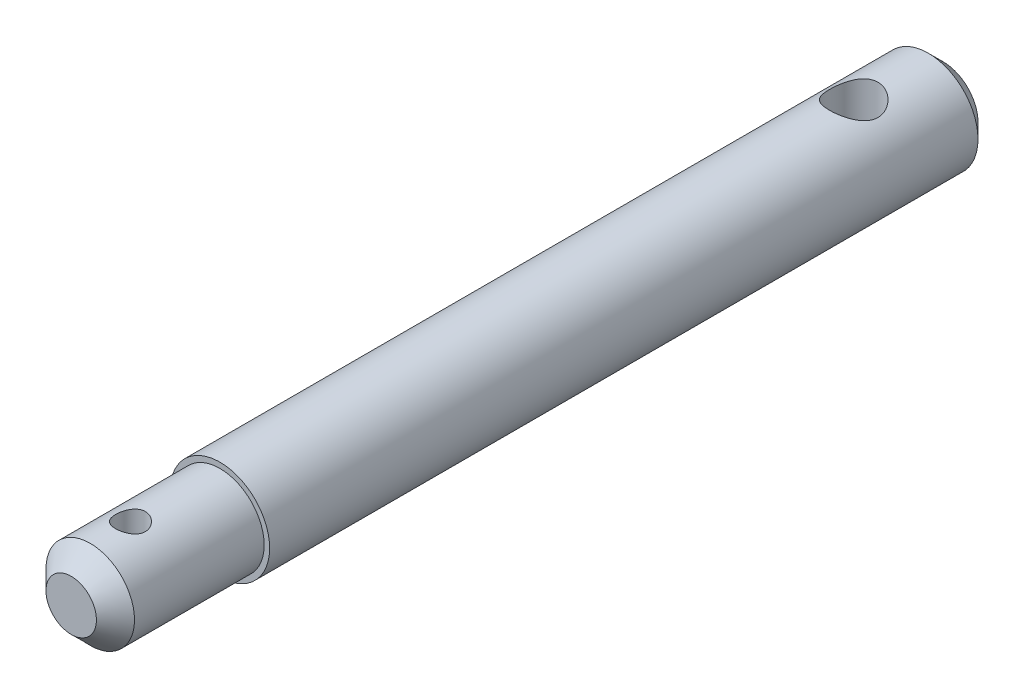
ISO-10303-21;
HEADER;
FILE_DESCRIPTION(('STEP AP214'),'2;1');
FILE_NAME('part.step','',(''),(''),'','','');
FILE_SCHEMA(('AUTOMOTIVE_DESIGN { 1 0 10303 214 1 1 1 1 }'));
ENDSEC;
DATA;
#1=APPLICATION_CONTEXT('core data for automotive mechanical design processes');
#2=APPLICATION_PROTOCOL_DEFINITION('international standard','automotive_design',2000,#1);
#3=PRODUCT_CONTEXT('',#1,'mechanical');
#4=PRODUCT('Part','Part','',(#3));
#5=PRODUCT_RELATED_PRODUCT_CATEGORY('part','',(#4));
#6=PRODUCT_DEFINITION_FORMATION('','',#4);
#7=PRODUCT_DEFINITION_CONTEXT('part definition',#1,'design');
#8=PRODUCT_DEFINITION('design','',#6,#7);
#9=PRODUCT_DEFINITION_SHAPE('','',#8);
#10=(LENGTH_UNIT() NAMED_UNIT(*) SI_UNIT(.MILLI.,.METRE.));
#11=(NAMED_UNIT(*) PLANE_ANGLE_UNIT() SI_UNIT($,.RADIAN.));
#12=(NAMED_UNIT(*) SI_UNIT($,.STERADIAN.) SOLID_ANGLE_UNIT());
#13=UNCERTAINTY_MEASURE_WITH_UNIT(LENGTH_MEASURE(1.E-05),#10,'distance_accuracy_value','');
#14=(GEOMETRIC_REPRESENTATION_CONTEXT(3) GLOBAL_UNCERTAINTY_ASSIGNED_CONTEXT((#13)) GLOBAL_UNIT_ASSIGNED_CONTEXT((#10,
#11,#12)) REPRESENTATION_CONTEXT('',''));
#15=CARTESIAN_POINT('',(0.,0.,0.));
#16=DIRECTION('',(0.,0.,1.));
#17=DIRECTION('',(1.,0.,0.));
#18=AXIS2_PLACEMENT_3D('',#15,#16,#17);
#19=CARTESIAN_POINT('',(0.,0.,46.5455));
#20=DIRECTION('',(0.,0.,1.));
#21=DIRECTION('',(1.,0.,0.));
#22=AXIS2_PLACEMENT_3D('',#19,#20,#21);
#23=PLANE('',#22);
#24=CARTESIAN_POINT('',(0.,0.,46.5454999999793));
#25=DIRECTION('',(0.,0.,-1.));
#26=DIRECTION('',(-1.,0.,0.));
#27=AXIS2_PLACEMENT_3D('',#24,#25,#26);
#28=CIRCLE('',#27,1.34620000000041);
#29=CARTESIAN_POINT('',(-1.34620000000041,0.,46.5454999999793));
#30=VERTEX_POINT('',#29);
#31=EDGE_CURVE('E17',#30,#30,#28,.T.);
#32=ORIENTED_EDGE('',*,*,#31,.F.);
#33=EDGE_LOOP('',(#32));
#34=FACE_BOUND('',#33,.T.);
#35=ADVANCED_FACE('F14',(#34),#23,.T.);
#36=CARTESIAN_POINT('',(0.,0.,45.5294999999865));
#37=DIRECTION('',(0.,0.,-1.));
#38=DIRECTION('',(-1.,0.,0.));
#39=AXIS2_PLACEMENT_3D('',#36,#37,#38);
#40=CONICAL_SURFACE('',#39,2.36219999999321,0.785398163397448);
#41=ORIENTED_EDGE('',*,*,#31,.T.);
#42=EDGE_LOOP('',(#41));
#43=FACE_BOUND('',#42,.T.);
#44=CARTESIAN_POINT('',(0.,0.,45.5295));
#45=DIRECTION('',(0.,0.,1.));
#46=DIRECTION('',(1.,0.,0.));
#47=AXIS2_PLACEMENT_3D('',#44,#45,#46);
#48=CIRCLE('',#47,2.3622);
#49=CARTESIAN_POINT('',(2.3622,0.,45.5295));
#50=VERTEX_POINT('',#49);
#51=EDGE_CURVE('E74',#50,#50,#48,.F.);
#52=ORIENTED_EDGE('',*,*,#51,.F.);
#53=EDGE_LOOP('',(#52));
#54=FACE_BOUND('',#53,.T.);
#55=ADVANCED_FACE('F94',(#43,#54),#40,.T.);
#56=CARTESIAN_POINT('',(0.,-12.7,43.3832));
#57=DIRECTION('',(0.,-1.,0.));
#58=DIRECTION('',(0.,0.,-1.));
#59=AXIS2_PLACEMENT_3D('',#56,#57,#58);
#60=CYLINDRICAL_SURFACE('',#59,0.79375);
#61=CARTESIAN_POINT('',(0.0789147910260834,-2.36088146584222,44.1730173955145));
#62=CARTESIAN_POINT('',(0.122507011681601,-2.35942430790102,44.1686618092289));
#63=CARTESIAN_POINT('',(0.165698028478989,-2.35676082438356,44.1606894490778));
#64=CARTESIAN_POINT('',(0.250012932307831,-2.34931394752991,44.1378138920095));
#65=CARTESIAN_POINT('',(0.29113625225935,-2.3445299761285,44.1229088051102));
#66=CARTESIAN_POINT('',(0.370122912277435,-2.33336395988406,44.0867141756947));
#67=CARTESIAN_POINT('',(0.407992552247541,-2.3269851013039,44.0654373460735));
#68=CARTESIAN_POINT('',(0.47965344487601,-2.31327781630098,44.0171088593755));
#69=CARTESIAN_POINT('',(0.513443978603177,-2.30594922296068,43.9900561866419));
#70=CARTESIAN_POINT('',(0.57723530537025,-2.29082957740467,43.9298502401553));
#71=CARTESIAN_POINT('',(0.607068555289485,-2.28303127128678,43.8965210779747));
#72=CARTESIAN_POINT('',(0.660784399884123,-2.26806796345517,43.825234946791));
#73=CARTESIAN_POINT('',(0.684666430168286,-2.26090302184889,43.7872775393705));
#74=CARTESIAN_POINT('',(0.725990017629597,-2.24797753083853,43.7072741076736));
#75=CARTESIAN_POINT('',(0.743364304289983,-2.24223184870206,43.6651907633595));
#76=CARTESIAN_POINT('',(0.770701655266178,-2.23298430668429,43.5784518604218));
#77=CARTESIAN_POINT('',(0.780667965000087,-2.22948146431323,43.5337974374313));
#78=CARTESIAN_POINT('',(0.792492738455014,-2.22530482146832,43.4455027189291));
#79=CARTESIAN_POINT('',(0.794719931423072,-2.22450242083551,43.4019177861813));
#80=CARTESIAN_POINT('',(0.792008852080534,-2.2254691684149,43.315004766584));
#81=CARTESIAN_POINT('',(0.787071637416175,-2.22723793705812,43.271676642771));
#82=CARTESIAN_POINT('',(0.77049230343537,-2.2330255240226,43.1878805437207));
#83=CARTESIAN_POINT('',(0.759060487724198,-2.23697366280072,43.1473656037016));
#84=CARTESIAN_POINT('',(0.730042352332865,-2.24661062802437,43.0688262701572));
#85=CARTESIAN_POINT('',(0.712454834007139,-2.25229979345751,43.030802363402));
#86=CARTESIAN_POINT('',(0.670890136452902,-2.26503487792193,42.9568067496328));
#87=CARTESIAN_POINT('',(0.646704152612892,-2.27212255697896,42.9209596739679));
#88=CARTESIAN_POINT('',(0.592898932463587,-2.2867522549457,42.8537042512372));
#89=CARTESIAN_POINT('',(0.563278092001751,-2.29429440755528,42.8222972195535));
#90=CARTESIAN_POINT('',(0.497797821533678,-2.30940795248484,42.7633072333394));
#91=CARTESIAN_POINT('',(0.461711707338043,-2.31696427299827,42.7359712453469));
#92=CARTESIAN_POINT('',(0.385253263427538,-2.33089606255561,42.6877424218067));
#93=CARTESIAN_POINT('',(0.344881261917955,-2.33727162191754,42.6668490933698));
#94=CARTESIAN_POINT('',(0.261420601994339,-2.34806227103857,42.6323922273944));
#95=CARTESIAN_POINT('',(0.218368663452577,-2.3524991322173,42.6187468991404));
#96=CARTESIAN_POINT('',(0.130407934810506,-2.3590091450882,42.5989403658029));
#97=CARTESIAN_POINT('',(0.0854998222808024,-2.36108315154752,42.59277645425));
#98=CARTESIAN_POINT('',(-0.00258948566120902,-2.36258975528251,42.5882886568374));
#99=CARTESIAN_POINT('',(-0.0457505775094392,-2.36214391344996,42.5896039816814));
#100=CARTESIAN_POINT('',(-0.131201580867929,-2.35894105652557,42.5991889114394));
#101=CARTESIAN_POINT('',(-0.173491542038681,-2.35618417355477,42.6074581188034));
#102=CARTESIAN_POINT('',(-0.255513841100328,-2.34869732735175,42.6305077569886));
#103=CARTESIAN_POINT('',(-0.295270688487352,-2.34399131636567,42.6452092628191));
#104=CARTESIAN_POINT('',(-0.371779264355224,-2.3330803873101,42.6806350767515));
#105=CARTESIAN_POINT('',(-0.408530391101295,-2.32687517008316,42.7013605870746));
#106=CARTESIAN_POINT('',(-0.479578898152038,-2.31329932432523,42.7492047113462));
#107=CARTESIAN_POINT('',(-0.513719365122218,-2.30589201244374,42.7765458549753));
#108=CARTESIAN_POINT('',(-0.57704398043099,-2.29086670269898,42.8364281289529));
#109=CARTESIAN_POINT('',(-0.60622664193417,-2.28324864242641,42.8689708135735));
#110=CARTESIAN_POINT('',(-0.659898438252904,-2.26833171872092,42.9397830672332));
#111=CARTESIAN_POINT('',(-0.684173428023466,-2.2610551634533,42.9782202381332));
#112=CARTESIAN_POINT('',(-0.725888589434195,-2.24801131054086,43.0588777959957));
#113=CARTESIAN_POINT('',(-0.743330199879502,-2.24224369526558,43.101097384247));
#114=CARTESIAN_POINT('',(-0.770436588034611,-2.2330736676992,43.1871106615142));
#115=CARTESIAN_POINT('',(-0.780274982611162,-2.22961870978147,43.2308437907582));
#116=CARTESIAN_POINT('',(-0.79244860364254,-2.22532190483711,43.3194618489594));
#117=CARTESIAN_POINT('',(-0.794786758311948,-2.22447903801238,43.3643463215131));
#118=CARTESIAN_POINT('',(-0.791943896703967,-2.22549190279037,43.4515232992628));
#119=CARTESIAN_POINT('',(-0.787143247892158,-2.22721113194264,43.4938304320974));
#120=CARTESIAN_POINT('',(-0.770895483236556,-2.23288647675488,43.5769896105455));
#121=CARTESIAN_POINT('',(-0.759447915373027,-2.23684274454284,43.6178415569995));
#122=CARTESIAN_POINT('',(-0.73024735038813,-2.24654474308444,43.6971605709738));
#123=CARTESIAN_POINT('',(-0.712471371945658,-2.25229698634746,43.7356183380957));
#124=CARTESIAN_POINT('',(-0.671145589711951,-2.26495433088748,43.8090877418001));
#125=CARTESIAN_POINT('',(-0.647594213554138,-2.2718597459548,43.8440984362644));
#126=CARTESIAN_POINT('',(-0.593928683488242,-2.28649281886259,43.9116356797061));
#127=CARTESIAN_POINT('',(-0.563534589037936,-2.29424461868482,43.9439348482147));
#128=CARTESIAN_POINT('',(-0.497747904977433,-2.30940988913043,44.0030733501513));
#129=CARTESIAN_POINT('',(-0.462354308228219,-2.31682329118517,44.0299115808199));
#130=CARTESIAN_POINT('',(-0.386602229937673,-2.33067375077234,44.0779167436937));
#131=CARTESIAN_POINT('',(-0.346152087905676,-2.33708590713711,44.0989467937185));
#132=CARTESIAN_POINT('',(-0.262033249804719,-2.34800384220129,44.1338320273355));
#133=CARTESIAN_POINT('',(-0.218366012893367,-2.35251047900034,44.1476904411128));
#134=CARTESIAN_POINT('',(-0.132481371108022,-2.3588452272238,44.1669582658532));
#135=CARTESIAN_POINT('',(-0.0904013414931988,-2.36084906823725,44.1729240029195));
#136=CARTESIAN_POINT('',(-0.00578413139185564,-2.36257169590233,44.1780594139379));
#137=CARTESIAN_POINT('',(0.0367529828442932,-2.36229080936002,44.1772300598554));
#138=CARTESIAN_POINT('',(0.0789147910260834,-2.36088146584222,44.1730173955145));
#139=B_SPLINE_CURVE_WITH_KNOTS('',3,(#61,#62,#63,#64,#65,#66,#67,#68,#69,#70,#71,#72,#73,#74,
#75,#76,#77,#78,#79,#80,#81,#82,#83,#84,#85,#86,#87,#88,#89,#90,#91,#92,#93,#94,#95,#96,#97,#98,
#99,#100,#101,#102,#103,#104,#105,#106,#107,#108,#109,#110,#111,#112,#113,#114,#115,#116,#117,
#118,#119,#120,#121,#122,#123,#124,#125,#126,#127,#128,#129,#130,#131,#132,#133,#134,#135,#136,
#137,#138),.UNSPECIFIED.,.T.,.F.,(4,2,2,2,2,2,2,2,2,2,2,2,2,2,2,2,2,2,2,2,2,2,2,2,2,2,2,2,2,2,2,
2,2,2,2,2,2,2,4),(0.,0.13134106751084,0.262717961891321,0.393834460092387,0.524974033578807,
0.660564380899213,0.79616758220752,0.933136174483464,1.07004472570163,1.2003334924612,
1.33060302728799,1.45687682380609,1.58317522219652,1.71405911254928,1.84498169692529,
1.98201617367131,2.11904016413106,2.25448315134646,2.38987712623243,2.51879703541851,
2.64770957482179,2.77508285825175,2.90248157926582,3.0349753438438,3.16750877314806,
3.30495625334641,3.44237477765785,3.5765542185817,3.71068126730863,3.83791309134451,
3.96515356871765,4.09286090783118,4.22060305426546,4.35506129350619,4.4895466578024,
4.62697349679021,4.76433838320401,4.89138786594468,5.01841917592413),.UNSPECIFIED.);
#140=CARTESIAN_POINT('',(0.0789147910260834,-2.36088146584222,44.1730173955145));
#141=VERTEX_POINT('',#140);
#142=EDGE_CURVE('E70',#141,#141,#139,.T.);
#143=ORIENTED_EDGE('',*,*,#142,.F.);
#144=EDGE_LOOP('',(#143));
#145=FACE_BOUND('',#144,.T.);
#146=CARTESIAN_POINT('',(-0.0789147910260789,2.36088146584222,44.1730173955145));
#147=CARTESIAN_POINT('',(-0.122507011681596,2.35942430790102,44.1686618092289));
#148=CARTESIAN_POINT('',(-0.165698028478984,2.35676082438356,44.1606894490778));
#149=CARTESIAN_POINT('',(-0.250012932307826,2.34931394752991,44.1378138920095));
#150=CARTESIAN_POINT('',(-0.291136252259345,2.3445299761285,44.1229088051102));
#151=CARTESIAN_POINT('',(-0.370122912277428,2.33336395988406,44.0867141756947));
#152=CARTESIAN_POINT('',(-0.40799255224753,2.3269851013039,44.0654373460735));
#153=CARTESIAN_POINT('',(-0.479653444875998,2.31327781630098,44.0171088593755));
#154=CARTESIAN_POINT('',(-0.513443978603166,2.30594922296068,43.9900561866419));
#155=CARTESIAN_POINT('',(-0.577235305370241,2.29082957740467,43.9298502401554));
#156=CARTESIAN_POINT('',(-0.607068555289476,2.28303127128678,43.8965210779748));
#157=CARTESIAN_POINT('',(-0.660784399884115,2.26806796345517,43.825234946791));
#158=CARTESIAN_POINT('',(-0.68466643016828,2.26090302184889,43.7872775393705));
#159=CARTESIAN_POINT('',(-0.725990017629592,2.24797753083853,43.7072741076736));
#160=CARTESIAN_POINT('',(-0.743364304289978,2.24223184870206,43.6651907633595));
#161=CARTESIAN_POINT('',(-0.770701655266173,2.23298430668429,43.5784518604218));
#162=CARTESIAN_POINT('',(-0.780667965000083,2.22948146431323,43.5337974374313));
#163=CARTESIAN_POINT('',(-0.792492738455011,2.22530482146832,43.4455027189291));
#164=CARTESIAN_POINT('',(-0.79471993142307,2.22450242083551,43.4019177861813));
#165=CARTESIAN_POINT('',(-0.792008852080532,2.2254691684149,43.315004766584));
#166=CARTESIAN_POINT('',(-0.787071637416174,2.22723793705811,43.271676642771));
#167=CARTESIAN_POINT('',(-0.770492303435369,2.2330255240226,43.1878805437207));
#168=CARTESIAN_POINT('',(-0.759060487724196,2.23697366280072,43.1473656037016));
#169=CARTESIAN_POINT('',(-0.730042352332863,2.24661062802437,43.0688262701572));
#170=CARTESIAN_POINT('',(-0.712454834007136,2.25229979345751,43.030802363402));
#171=CARTESIAN_POINT('',(-0.6708901364529,2.26503487792192,42.9568067496328));
#172=CARTESIAN_POINT('',(-0.64670415261289,2.27212255697896,42.9209596739679));
#173=CARTESIAN_POINT('',(-0.592898932463587,2.2867522549457,42.8537042512372));
#174=CARTESIAN_POINT('',(-0.563278092001753,2.29429440755528,42.8222972195535));
#175=CARTESIAN_POINT('',(-0.497797821533683,2.30940795248484,42.7633072333394));
#176=CARTESIAN_POINT('',(-0.46171170733805,2.31696427299827,42.7359712453469));
#177=CARTESIAN_POINT('',(-0.385253263427545,2.33089606255561,42.6877424218067));
#178=CARTESIAN_POINT('',(-0.344881261917961,2.33727162191754,42.6668490933699));
#179=CARTESIAN_POINT('',(-0.261420601994344,2.34806227103857,42.6323922273944));
#180=CARTESIAN_POINT('',(-0.218368663452583,2.3524991322173,42.6187468991404));
#181=CARTESIAN_POINT('',(-0.130407934810512,2.3590091450882,42.5989403658029));
#182=CARTESIAN_POINT('',(-0.0854998222808061,2.36108315154752,42.59277645425));
#183=CARTESIAN_POINT('',(0.00258948566120674,2.36258975528251,42.5882886568374));
#184=CARTESIAN_POINT('',(0.0457505775094371,2.36214391344996,42.5896039816814));
#185=CARTESIAN_POINT('',(0.131201580867926,2.35894105652557,42.5991889114394));
#186=CARTESIAN_POINT('',(0.173491542038678,2.35618417355477,42.6074581188034));
#187=CARTESIAN_POINT('',(0.255513841100326,2.34869732735175,42.6305077569886));
#188=CARTESIAN_POINT('',(0.295270688487351,2.34399131636567,42.6452092628191));
#189=CARTESIAN_POINT('',(0.371779264355224,2.3330803873101,42.6806350767515));
#190=CARTESIAN_POINT('',(0.408530391101295,2.32687517008316,42.7013605870746));
#191=CARTESIAN_POINT('',(0.479578898152037,2.31329932432523,42.7492047113462));
#192=CARTESIAN_POINT('',(0.513719365122216,2.30589201244374,42.7765458549753));
#193=CARTESIAN_POINT('',(0.577043980430988,2.29086670269899,42.8364281289528));
#194=CARTESIAN_POINT('',(0.606226641934168,2.28324864242642,42.8689708135735));
#195=CARTESIAN_POINT('',(0.659898438252903,2.26833171872092,42.9397830672332));
#196=CARTESIAN_POINT('',(0.684173428023463,2.26105516345331,42.9782202381332));
#197=CARTESIAN_POINT('',(0.725888589434194,2.24801131054086,43.0588777959957));
#198=CARTESIAN_POINT('',(0.743330199879503,2.24224369526558,43.1010973842469));
#199=CARTESIAN_POINT('',(0.770436588034612,2.23307366769921,43.1871106615142));
#200=CARTESIAN_POINT('',(0.780274982611162,2.22961870978147,43.2308437907582));
#201=CARTESIAN_POINT('',(0.792448603642542,2.22532190483712,43.3194618489594));
#202=CARTESIAN_POINT('',(0.794786758311951,2.22447903801238,43.3643463215131));
#203=CARTESIAN_POINT('',(0.79194389670397,2.22549190279037,43.4515232992628));
#204=CARTESIAN_POINT('',(0.787143247892161,2.22721113194264,43.4938304320974));
#205=CARTESIAN_POINT('',(0.77089548323656,2.23288647675488,43.5769896105455));
#206=CARTESIAN_POINT('',(0.759447915373031,2.23684274454284,43.6178415569995));
#207=CARTESIAN_POINT('',(0.730247350388133,2.24654474308444,43.6971605709738));
#208=CARTESIAN_POINT('',(0.71247137194566,2.25229698634746,43.7356183380957));
#209=CARTESIAN_POINT('',(0.671145589711954,2.26495433088748,43.8090877418001));
#210=CARTESIAN_POINT('',(0.647594213554145,2.2718597459548,43.8440984362644));
#211=CARTESIAN_POINT('',(0.593928683488251,2.28649281886259,43.9116356797061));
#212=CARTESIAN_POINT('',(0.563534589037944,2.29424461868482,43.9439348482147));
#213=CARTESIAN_POINT('',(0.497747904977441,2.30940988913043,44.0030733501513));
#214=CARTESIAN_POINT('',(0.462354308228226,2.31682329118517,44.0299115808199));
#215=CARTESIAN_POINT('',(0.386602229937679,2.33067375077234,44.0779167436937));
#216=CARTESIAN_POINT('',(0.346152087905682,2.33708590713711,44.0989467937185));
#217=CARTESIAN_POINT('',(0.262033249804725,2.34800384220129,44.1338320273355));
#218=CARTESIAN_POINT('',(0.218366012893374,2.35251047900034,44.1476904411128));
#219=CARTESIAN_POINT('',(0.132481371108028,2.3588452272238,44.1669582658532));
#220=CARTESIAN_POINT('',(0.0904013414932049,2.36084906823725,44.1729240029195));
#221=CARTESIAN_POINT('',(0.00578413139186093,2.36257169590233,44.1780594139379));
#222=CARTESIAN_POINT('',(-0.0367529828442883,2.36229080936002,44.1772300598554));
#223=CARTESIAN_POINT('',(-0.0789147910260789,2.36088146584222,44.1730173955145));
#224=B_SPLINE_CURVE_WITH_KNOTS('',3,(#146,#147,#148,#149,#150,#151,#152,#153,#154,#155,#156,
#157,#158,#159,#160,#161,#162,#163,#164,#165,#166,#167,#168,#169,#170,#171,#172,#173,#174,#175,
#176,#177,#178,#179,#180,#181,#182,#183,#184,#185,#186,#187,#188,#189,#190,#191,#192,#193,#194,
#195,#196,#197,#198,#199,#200,#201,#202,#203,#204,#205,#206,#207,#208,#209,#210,#211,#212,#213,
#214,#215,#216,#217,#218,#219,#220,#221,#222,#223),.UNSPECIFIED.,.T.,.F.,(4,2,2,2,2,2,2,2,2,2,2,
2,2,2,2,2,2,2,2,2,2,2,2,2,2,2,2,2,2,2,2,2,2,2,2,2,2,2,4),(0.,0.13134106751084,0.262717961891318,
0.393834460092377,0.5249740335788,0.660564380899207,0.796167582207515,0.93313617448346,
1.07004472570162,1.2003334924612,1.33060302728798,1.45687682380609,1.58317522219653,
1.71405911254928,1.84498169692528,1.98201617367131,2.11904016413105,2.25448315134645,
2.38987712623243,2.51879703541851,2.64770957482178,2.77508285825175,2.90248157926582,
3.0349753438438,3.16750877314806,3.3049562533464,3.44237477765786,3.5765542185817,
3.71068126730863,3.83791309134451,3.96515356871766,4.09286090783117,4.22060305426546,
4.35506129350619,4.4895466578024,4.6269734967902,4.76433838320401,4.89138786594468,
5.01841917592413),.UNSPECIFIED.);
#225=CARTESIAN_POINT('',(-0.0789147910260789,2.36088146584222,44.1730173955145));
#226=VERTEX_POINT('',#225);
#227=EDGE_CURVE('E79',#226,#226,#224,.T.);
#228=ORIENTED_EDGE('',*,*,#227,.F.);
#229=EDGE_LOOP('',(#228));
#230=FACE_BOUND('',#229,.T.);
#231=ADVANCED_FACE('F82',(#145,#230),#60,.F.);
#232=CARTESIAN_POINT('',(0.,0.,0.));
#233=DIRECTION('',(0.,0.,1.));
#234=DIRECTION('',(1.,0.,0.));
#235=AXIS2_PLACEMENT_3D('',#232,#233,#234);
#236=PLANE('',#235);
#237=CARTESIAN_POINT('',(0.,0.,0.));
#238=DIRECTION('',(0.,0.,1.));
#239=DIRECTION('',(1.,0.,0.));
#240=AXIS2_PLACEMENT_3D('',#237,#238,#239);
#241=CIRCLE('',#240,1.86055000000351);
#242=CARTESIAN_POINT('',(1.86055000000351,0.,0.));
#243=VERTEX_POINT('',#242);
#244=EDGE_CURVE('E67',#243,#243,#241,.T.);
#245=ORIENTED_EDGE('',*,*,#244,.F.);
#246=EDGE_LOOP('',(#245));
#247=FACE_BOUND('',#246,.T.);
#248=ADVANCED_FACE('F87',(#247),#236,.F.);
#249=CARTESIAN_POINT('',(0.,0.,46.5455));
#250=DIRECTION('',(0.,0.,1.));
#251=DIRECTION('',(1.,0.,0.));
#252=AXIS2_PLACEMENT_3D('',#249,#250,#251);
#253=CYLINDRICAL_SURFACE('',#252,2.3622);
#254=ORIENTED_EDGE('',*,*,#142,.T.);
#255=EDGE_LOOP('',(#254));
#256=FACE_BOUND('',#255,.T.);
#257=CARTESIAN_POINT('',(0.,0.,38.608));
#258=DIRECTION('',(0.,0.,1.));
#259=DIRECTION('',(1.,0.,0.));
#260=AXIS2_PLACEMENT_3D('',#257,#258,#259);
#261=CIRCLE('',#260,2.3622);
#262=CARTESIAN_POINT('',(2.3622,0.,38.608));
#263=VERTEX_POINT('',#262);
#264=EDGE_CURVE('E69',#263,#263,#261,.F.);
#265=ORIENTED_EDGE('',*,*,#264,.F.);
#266=EDGE_LOOP('',(#265));
#267=FACE_BOUND('',#266,.T.);
#268=ORIENTED_EDGE('',*,*,#51,.T.);
#269=EDGE_LOOP('',(#268));
#270=FACE_BOUND('',#269,.T.);
#271=ORIENTED_EDGE('',*,*,#227,.T.);
#272=EDGE_LOOP('',(#271));
#273=FACE_BOUND('',#272,.T.);
#274=ADVANCED_FACE('F61',(#256,#267,#270,#273),#253,.T.);
#275=CARTESIAN_POINT('',(0.,-12.7,4.7752));
#276=DIRECTION('',(0.,-1.,0.));
#277=DIRECTION('',(0.,0.,-1.));
#278=AXIS2_PLACEMENT_3D('',#275,#276,#277);
#279=CYLINDRICAL_SURFACE('',#278,1.2954);
#280=CARTESIAN_POINT('',(0.0648764532367761,-2.65350702577088,6.06897440298354));
#281=CARTESIAN_POINT('',(0.133868480645646,-2.65181674520319,6.0655107410342));
#282=CARTESIAN_POINT('',(0.202609125233445,-2.64741772728217,6.05650222368062));
#283=CARTESIAN_POINT('',(0.33738791352858,-2.63364629976367,6.02779752112032));
#284=CARTESIAN_POINT('',(0.403419641657243,-2.62426274376704,6.00807738039661));
#285=CARTESIAN_POINT('',(0.530656569211713,-2.60151333856505,5.95887933567231));
#286=CARTESIAN_POINT('',(0.591881022232246,-2.58816452032569,5.92944310376191));
#287=CARTESIAN_POINT('',(0.708480781174213,-2.55870765018919,5.86178348903647));
#288=CARTESIAN_POINT('',(0.76385690261249,-2.54259998382132,5.82356133373632));
#289=CARTESIAN_POINT('',(0.871149336101604,-2.50794462596062,5.73656941929993));
#290=CARTESIAN_POINT('',(0.92261508309841,-2.48930666765786,5.68727993268321));
#291=CARTESIAN_POINT('',(1.01687442406809,-2.45231395937846,5.58085843418306));
#292=CARTESIAN_POINT('',(1.05966199824605,-2.43395941409568,5.52372102419242));
#293=CARTESIAN_POINT('',(1.13766565370879,-2.39853382534432,5.39927196451817));
#294=CARTESIAN_POINT('',(1.1723225613974,-2.3815924847592,5.33156943907502));
#295=CARTESIAN_POINT('',(1.22946757917352,-2.35260629218195,5.1902464291801));
#296=CARTESIAN_POINT('',(1.25196839597547,-2.34055633054028,5.11663221703862));
#297=CARTESIAN_POINT('',(1.28232068408982,-2.32405665710367,4.9719717803928));
#298=CARTESIAN_POINT('',(1.29122155699627,-2.31906503062603,4.90120948674832));
#299=CARTESIAN_POINT('',(1.29724837663862,-2.31570112930661,4.75904519412292));
#300=CARTESIAN_POINT('',(1.29438113161958,-2.31732502716138,4.68764358885798));
#301=CARTESIAN_POINT('',(1.27792916045325,-2.32642958992769,4.55370701660913));
#302=CARTESIAN_POINT('',(1.26542995044705,-2.33331649891794,4.49099237770263));
#303=CARTESIAN_POINT('',(1.2315871638005,-2.35135419302652,4.36864704694494));
#304=CARTESIAN_POINT('',(1.21024086081653,-2.36250629243537,4.30901731212302));
#305=CARTESIAN_POINT('',(1.15811930819168,-2.3885047327688,4.19108490289692));
#306=CARTESIAN_POINT('',(1.12691555553839,-2.40351158277957,4.13300823782876));
#307=CARTESIAN_POINT('',(1.05636801173814,-2.43534229228175,4.02257367031538));
#308=CARTESIAN_POINT('',(1.01701996790472,-2.45216709884891,3.97021877750694));
#309=CARTESIAN_POINT('',(0.925858481682941,-2.48812501754728,3.86625970631219));
#310=CARTESIAN_POINT('',(0.873121677251269,-2.50729606965981,3.81547445281384));
#311=CARTESIAN_POINT('',(0.759493182687253,-2.54402085567034,3.7232562505437));
#312=CARTESIAN_POINT('',(0.698599465712805,-2.56157418575848,3.68182563311996));
#313=CARTESIAN_POINT('',(0.568845969374355,-2.59350264090428,3.60896640692686));
#314=CARTESIAN_POINT('',(0.499867961195084,-2.60781840459086,3.57772058848985));
#315=CARTESIAN_POINT('',(0.356735086928604,-2.63121444582647,3.52758720921527));
#316=CARTESIAN_POINT('',(0.282584655105693,-2.64029914754253,3.50868920339556));
#317=CARTESIAN_POINT('',(0.138457399617455,-2.65158173381486,3.4853431818457));
#318=CARTESIAN_POINT('',(0.0687093443735671,-2.65432799805653,3.47974321292911));
#319=CARTESIAN_POINT('',(-0.0707655922304326,-2.65427160401539,3.47985760260411));
#320=CARTESIAN_POINT('',(-0.140492473796407,-2.65147057422181,3.48556864068432));
#321=CARTESIAN_POINT('',(-0.2737267943391,-2.6409458008792,3.50735554964032));
#322=CARTESIAN_POINT('',(-0.337360775520733,-2.63351593435899,3.52281328213426));
#323=CARTESIAN_POINT('',(-0.461048585241735,-2.61470056782919,3.562878391637));
#324=CARTESIAN_POINT('',(-0.521101856860162,-2.60331445436044,3.58748718765941));
#325=CARTESIAN_POINT('',(-0.639073723203397,-2.57695913968476,3.64639676275618));
#326=CARTESIAN_POINT('',(-0.696758820202904,-2.56184652060834,3.6810991877923));
#327=CARTESIAN_POINT('',(-0.805746764544793,-2.52968673898605,3.75867966833919));
#328=CARTESIAN_POINT('',(-0.857046198017745,-2.51263855088935,3.80156206622524));
#329=CARTESIAN_POINT('',(-0.956934543232474,-2.47642258721262,3.89903831542848));
#330=CARTESIAN_POINT('',(-1.00479978126048,-2.45720759883484,3.95435865192324));
#331=CARTESIAN_POINT('',(-1.09077181561513,-2.42027265862586,4.07261615337022));
#332=CARTESIAN_POINT('',(-1.12887476454051,-2.40255329807346,4.13555630701168));
#333=CARTESIAN_POINT('',(-1.19478590223252,-2.37047883801169,4.26904809135323));
#334=CARTESIAN_POINT('',(-1.22238236099399,-2.356194872752,4.3397226709071));
#335=CARTESIAN_POINT('',(-1.26490630786399,-2.33364830118684,4.48566714675104));
#336=CARTESIAN_POINT('',(-1.27985117040977,-2.32537743929909,4.56093058828383));
#337=CARTESIAN_POINT('',(-1.2952966511923,-2.31680410168557,4.70499126546947));
#338=CARTESIAN_POINT('',(-1.2972005425207,-2.3157278048954,4.77359338659779));
#339=CARTESIAN_POINT('',(-1.29017043168332,-2.3196519424192,4.91005856376309));
#340=CARTESIAN_POINT('',(-1.28123738867587,-2.32465183893987,4.97792168467134));
#341=CARTESIAN_POINT('',(-1.25391378926098,-2.33949274012935,5.10658557274323));
#342=CARTESIAN_POINT('',(-1.23615577576923,-2.34900825677716,5.16756174070149));
#343=CARTESIAN_POINT('',(-1.19223706359645,-2.37159998539055,5.2856964206532));
#344=CARTESIAN_POINT('',(-1.16607371614738,-2.38467731959165,5.34285372234167));
#345=CARTESIAN_POINT('',(-1.10340333545414,-2.41435549731752,5.45724609335024));
#346=CARTESIAN_POINT('',(-1.06618267557797,-2.43116640614489,5.51403484634522));
#347=CARTESIAN_POINT('',(-0.983524006469098,-2.46576492658346,5.6209619988977));
#348=CARTESIAN_POINT('',(-0.938081497066402,-2.48355306934512,5.67109673024282));
#349=CARTESIAN_POINT('',(-0.834774245966087,-2.52026987145446,5.76855559092265));
#350=CARTESIAN_POINT('',(-0.776114535386685,-2.53912925229965,5.8150685920558));
#351=CARTESIAN_POINT('',(-0.651028936363493,-2.57403957648584,5.8976232819777));
#352=CARTESIAN_POINT('',(-0.584600937260344,-2.5900897535894,5.93366211560119));
#353=CARTESIAN_POINT('',(-0.447241367077696,-2.61726446924889,5.99319512525256));
#354=CARTESIAN_POINT('',(-0.376446427332646,-2.62849264447884,6.01695574193279));
#355=CARTESIAN_POINT('',(-0.23128889009228,-2.64520548281726,6.05195623453873));
#356=CARTESIAN_POINT('',(-0.156937119673453,-2.65070654413357,6.06323186413457));
#357=CARTESIAN_POINT('',(-0.0577189930573689,-2.6537869384557,6.06954772751379));
#358=CARTESIAN_POINT('',(-0.0332005126109005,-2.65420575229292,6.07040680719664));
#359=CARTESIAN_POINT('',(0.015848028713118,-2.65436588717198,6.07073508101222));
#360=CARTESIAN_POINT('',(0.0403780892482206,-2.65410722712958,6.07020431395087));
#361=CARTESIAN_POINT('',(0.0648764532367761,-2.65350702577088,6.06897440298354));
#362=B_SPLINE_CURVE_WITH_KNOTS('',3,(#280,#281,#282,#283,#284,#285,#286,#287,#288,#289,#290,
#291,#292,#293,#294,#295,#296,#297,#298,#299,#300,#301,#302,#303,#304,#305,#306,#307,#308,#309,
#310,#311,#312,#313,#314,#315,#316,#317,#318,#319,#320,#321,#322,#323,#324,#325,#326,#327,#328,
#329,#330,#331,#332,#333,#334,#335,#336,#337,#338,#339,#340,#341,#342,#343,#344,#345,#346,#347,
#348,#349,#350,#351,#352,#353,#354,#355,#356,#357,#358,#359,#360,#361),.UNSPECIFIED.,.T.,.F.,(4,
2,2,2,2,2,2,2,2,2,2,2,2,2,2,2,2,2,2,2,2,2,2,2,2,2,2,2,2,2,2,2,2,2,2,2,2,2,2,2,4),(0.,
0.20719773952625,0.414860776258819,0.621644479765307,0.828399310272485,1.04843180750938,
1.26861641674166,1.5011489573511,1.73343795998535,1.94669090485774,2.15982049325082,
2.35191855567279,2.54407585960991,2.7461167226673,2.94826335231663,3.17428411364203,
3.40036114149382,3.63029698317352,3.8600380700551,4.06900823863501,4.27791707006132,
4.47475151330636,4.67161649150546,4.87774702863289,5.08398729714672,5.30987325975467,
5.53584810947841,5.76616214408424,5.99615937294516,6.20095500113504,6.40573250454014,
6.59758456363294,6.78949714035604,6.99849933642018,7.20761627631431,7.43810873743069,
7.66866396994651,7.89398036991544,8.1186498414946,8.19222569599216,8.26579949620008),.UNSPECIFIED.);
#363=CARTESIAN_POINT('',(0.0648764532367761,-2.65350702577088,6.06897440298354));
#364=VERTEX_POINT('',#363);
#365=EDGE_CURVE('E38',#364,#364,#362,.T.);
#366=ORIENTED_EDGE('',*,*,#365,.F.);
#367=EDGE_LOOP('',(#366));
#368=FACE_BOUND('',#367,.T.);
#369=CARTESIAN_POINT('',(-0.0648764532367762,2.65350702577088,6.06897440298354));
#370=CARTESIAN_POINT('',(-0.133868480645646,2.65181674520319,6.0655107410342));
#371=CARTESIAN_POINT('',(-0.202609125233445,2.64741772728217,6.05650222368062));
#372=CARTESIAN_POINT('',(-0.33738791352858,2.63364629976367,6.02779752112032));
#373=CARTESIAN_POINT('',(-0.403419641657243,2.62426274376704,6.00807738039661));
#374=CARTESIAN_POINT('',(-0.530656569211713,2.60151333856505,5.95887933567231));
#375=CARTESIAN_POINT('',(-0.591881022232246,2.58816452032569,5.92944310376191));
#376=CARTESIAN_POINT('',(-0.708480781174213,2.55870765018919,5.86178348903647));
#377=CARTESIAN_POINT('',(-0.76385690261249,2.54259998382132,5.82356133373632));
#378=CARTESIAN_POINT('',(-0.871149336101604,2.50794462596061,5.73656941929993));
#379=CARTESIAN_POINT('',(-0.92261508309841,2.48930666765786,5.68727993268321));
#380=CARTESIAN_POINT('',(-1.01687442406809,2.45231395937846,5.58085843418306));
#381=CARTESIAN_POINT('',(-1.05966199824605,2.43395941409568,5.52372102419242));
#382=CARTESIAN_POINT('',(-1.13766565370879,2.39853382534432,5.39927196451817));
#383=CARTESIAN_POINT('',(-1.1723225613974,2.3815924847592,5.33156943907502));
#384=CARTESIAN_POINT('',(-1.22946757917352,2.35260629218195,5.1902464291801));
#385=CARTESIAN_POINT('',(-1.25196839597547,2.34055633054028,5.11663221703862));
#386=CARTESIAN_POINT('',(-1.28232068408982,2.32405665710367,4.9719717803928));
#387=CARTESIAN_POINT('',(-1.29122155699627,2.31906503062603,4.90120948674832));
#388=CARTESIAN_POINT('',(-1.29724837663862,2.31570112930661,4.75904519412292));
#389=CARTESIAN_POINT('',(-1.29438113161958,2.31732502716138,4.68764358885798));
#390=CARTESIAN_POINT('',(-1.27792916045325,2.32642958992769,4.55370701660913));
#391=CARTESIAN_POINT('',(-1.26542995044705,2.33331649891794,4.49099237770263));
#392=CARTESIAN_POINT('',(-1.2315871638005,2.35135419302652,4.36864704694494));
#393=CARTESIAN_POINT('',(-1.21024086081653,2.36250629243537,4.30901731212302));
#394=CARTESIAN_POINT('',(-1.15811930819168,2.3885047327688,4.19108490289692));
#395=CARTESIAN_POINT('',(-1.12691555553839,2.40351158277957,4.13300823782876));
#396=CARTESIAN_POINT('',(-1.05636801173814,2.43534229228175,4.02257367031538));
#397=CARTESIAN_POINT('',(-1.01701996790472,2.45216709884891,3.97021877750694));
#398=CARTESIAN_POINT('',(-0.925858481682941,2.48812501754728,3.86625970631219));
#399=CARTESIAN_POINT('',(-0.873121677251269,2.50729606965981,3.81547445281384));
#400=CARTESIAN_POINT('',(-0.759493182687253,2.54402085567034,3.7232562505437));
#401=CARTESIAN_POINT('',(-0.698599465712805,2.56157418575848,3.68182563311996));
#402=CARTESIAN_POINT('',(-0.568845969374355,2.59350264090428,3.60896640692685));
#403=CARTESIAN_POINT('',(-0.499867961195083,2.60781840459086,3.57772058848985));
#404=CARTESIAN_POINT('',(-0.356735086928603,2.63121444582647,3.52758720921527));
#405=CARTESIAN_POINT('',(-0.282584655105692,2.64029914754253,3.50868920339556));
#406=CARTESIAN_POINT('',(-0.138457399617455,2.65158173381486,3.4853431818457));
#407=CARTESIAN_POINT('',(-0.0687093443735668,2.65432799805653,3.47974321292911));
#408=CARTESIAN_POINT('',(0.0707655922304329,2.65427160401539,3.47985760260411));
#409=CARTESIAN_POINT('',(0.140492473796408,2.65147057422181,3.48556864068432));
#410=CARTESIAN_POINT('',(0.2737267943391,2.6409458008792,3.50735554964032));
#411=CARTESIAN_POINT('',(0.337360775520733,2.63351593435899,3.52281328213426));
#412=CARTESIAN_POINT('',(0.461048585241736,2.61470056782919,3.562878391637));
#413=CARTESIAN_POINT('',(0.521101856860162,2.60331445436044,3.58748718765941));
#414=CARTESIAN_POINT('',(0.639073723203397,2.57695913968476,3.64639676275618));
#415=CARTESIAN_POINT('',(0.696758820202904,2.56184652060834,3.6810991877923));
#416=CARTESIAN_POINT('',(0.805746764544793,2.52968673898605,3.75867966833919));
#417=CARTESIAN_POINT('',(0.857046198017745,2.51263855088935,3.80156206622524));
#418=CARTESIAN_POINT('',(0.956934543232475,2.47642258721262,3.89903831542848));
#419=CARTESIAN_POINT('',(1.00479978126048,2.45720759883484,3.95435865192324));
#420=CARTESIAN_POINT('',(1.09077181561514,2.42027265862586,4.07261615337022));
#421=CARTESIAN_POINT('',(1.12887476454051,2.40255329807346,4.13555630701168));
#422=CARTESIAN_POINT('',(1.19478590223252,2.37047883801169,4.26904809135323));
#423=CARTESIAN_POINT('',(1.22238236099399,2.356194872752,4.3397226709071));
#424=CARTESIAN_POINT('',(1.26490630786399,2.33364830118684,4.48566714675104));
#425=CARTESIAN_POINT('',(1.27985117040977,2.32537743929909,4.56093058828383));
#426=CARTESIAN_POINT('',(1.2952966511923,2.31680410168557,4.70499126546948));
#427=CARTESIAN_POINT('',(1.2972005425207,2.3157278048954,4.77359338659779));
#428=CARTESIAN_POINT('',(1.29017043168332,2.3196519424192,4.91005856376309));
#429=CARTESIAN_POINT('',(1.28123738867587,2.32465183893987,4.97792168467134));
#430=CARTESIAN_POINT('',(1.25391378926098,2.33949274012935,5.10658557274323));
#431=CARTESIAN_POINT('',(1.23615577576923,2.34900825677716,5.16756174070149));
#432=CARTESIAN_POINT('',(1.19223706359645,2.37159998539055,5.2856964206532));
#433=CARTESIAN_POINT('',(1.16607371614738,2.38467731959165,5.34285372234167));
#434=CARTESIAN_POINT('',(1.10340333545414,2.41435549731752,5.45724609335024));
#435=CARTESIAN_POINT('',(1.06618267557797,2.43116640614489,5.51403484634522));
#436=CARTESIAN_POINT('',(0.983524006469098,2.46576492658346,5.6209619988977));
#437=CARTESIAN_POINT('',(0.938081497066402,2.48355306934512,5.67109673024282));
#438=CARTESIAN_POINT('',(0.834774245966087,2.52026987145446,5.76855559092265));
#439=CARTESIAN_POINT('',(0.776114535386685,2.53912925229965,5.8150685920558));
#440=CARTESIAN_POINT('',(0.651028936363492,2.57403957648584,5.8976232819777));
#441=CARTESIAN_POINT('',(0.584600937260344,2.5900897535894,5.93366211560119));
#442=CARTESIAN_POINT('',(0.447241367077697,2.61726446924889,5.99319512525256));
#443=CARTESIAN_POINT('',(0.376446427332647,2.62849264447884,6.01695574193279));
#444=CARTESIAN_POINT('',(0.231288890092281,2.64520548281726,6.05195623453873));
#445=CARTESIAN_POINT('',(0.156937119673454,2.65070654413357,6.06323186413457));
#446=CARTESIAN_POINT('',(0.0577189930573689,2.6537869384557,6.06954772751379));
#447=CARTESIAN_POINT('',(0.0332005126109005,2.65420575229292,6.07040680719664));
#448=CARTESIAN_POINT('',(-0.015848028713118,2.65436588717198,6.07073508101222));
#449=CARTESIAN_POINT('',(-0.0403780892482206,2.65410722712958,6.07020431395087));
#450=CARTESIAN_POINT('',(-0.0648764532367762,2.65350702577088,6.06897440298354));
#451=B_SPLINE_CURVE_WITH_KNOTS('',3,(#369,#370,#371,#372,#373,#374,#375,#376,#377,#378,#379,
#380,#381,#382,#383,#384,#385,#386,#387,#388,#389,#390,#391,#392,#393,#394,#395,#396,#397,#398,
#399,#400,#401,#402,#403,#404,#405,#406,#407,#408,#409,#410,#411,#412,#413,#414,#415,#416,#417,
#418,#419,#420,#421,#422,#423,#424,#425,#426,#427,#428,#429,#430,#431,#432,#433,#434,#435,#436,
#437,#438,#439,#440,#441,#442,#443,#444,#445,#446,#447,#448,#449,#450),.UNSPECIFIED.,.T.,.F.,(4,
2,2,2,2,2,2,2,2,2,2,2,2,2,2,2,2,2,2,2,2,2,2,2,2,2,2,2,2,2,2,2,2,2,2,2,2,2,2,2,4),(0.,
0.20719773952625,0.414860776258819,0.621644479765307,0.828399310272485,1.04843180750938,
1.26861641674166,1.5011489573511,1.73343795998535,1.94669090485774,2.15982049325082,
2.35191855567279,2.54407585960991,2.7461167226673,2.94826335231663,3.17428411364203,
3.40036114149382,3.63029698317352,3.8600380700551,4.06900823863501,4.27791707006132,
4.47475151330636,4.67161649150546,4.87774702863289,5.08398729714672,5.30987325975468,
5.53584810947841,5.76616214408424,5.99615937294516,6.20095500113504,6.40573250454014,
6.59758456363294,6.78949714035604,6.99849933642018,7.20761627631431,7.43810873743069,
7.66866396994651,7.89398036991544,8.1186498414946,8.19222569599216,8.26579949620008),.UNSPECIFIED.);
#452=CARTESIAN_POINT('',(-0.0648764532367762,2.65350702577088,6.06897440298354));
#453=VERTEX_POINT('',#452);
#454=EDGE_CURVE('E26',#453,#453,#451,.T.);
#455=ORIENTED_EDGE('',*,*,#454,.F.);
#456=EDGE_LOOP('',(#455));
#457=FACE_BOUND('',#456,.T.);
#458=ADVANCED_FACE('F42',(#368,#457),#279,.F.);
#459=CARTESIAN_POINT('',(0.,0.,0.793750000013915));
#460=DIRECTION('',(0.,0.,1.));
#461=DIRECTION('',(1.,0.,0.));
#462=AXIS2_PLACEMENT_3D('',#459,#460,#461);
#463=CONICAL_SURFACE('',#462,2.65430000007427,0.785398163433255);
#464=CARTESIAN_POINT('',(0.,0.,0.793750000000003));
#465=DIRECTION('',(0.,0.,1.));
#466=DIRECTION('',(1.,0.,0.));
#467=AXIS2_PLACEMENT_3D('',#464,#465,#466);
#468=CIRCLE('',#467,2.6543);
#469=CARTESIAN_POINT('',(2.6543,0.,0.793750000000003));
#470=VERTEX_POINT('',#469);
#471=EDGE_CURVE('E21',#470,#470,#468,.T.);
#472=ORIENTED_EDGE('',*,*,#471,.F.);
#473=EDGE_LOOP('',(#472));
#474=FACE_BOUND('',#473,.T.);
#475=ORIENTED_EDGE('',*,*,#244,.T.);
#476=EDGE_LOOP('',(#475));
#477=FACE_BOUND('',#476,.T.);
#478=ADVANCED_FACE('F53',(#474,#477),#463,.T.);
#479=CARTESIAN_POINT('',(0.,0.,38.608));
#480=DIRECTION('',(0.,0.,1.));
#481=DIRECTION('',(1.,0.,0.));
#482=AXIS2_PLACEMENT_3D('',#479,#480,#481);
#483=PLANE('',#482);
#484=ORIENTED_EDGE('',*,*,#264,.T.);
#485=EDGE_LOOP('',(#484));
#486=FACE_BOUND('',#485,.T.);
#487=CARTESIAN_POINT('',(0.,0.,38.608));
#488=DIRECTION('',(0.,0.,1.));
#489=DIRECTION('',(1.,0.,0.));
#490=AXIS2_PLACEMENT_3D('',#487,#488,#489);
#491=CIRCLE('',#490,2.6543);
#492=CARTESIAN_POINT('',(2.6543,0.,38.608));
#493=VERTEX_POINT('',#492);
#494=EDGE_CURVE('E10',#493,#493,#491,.F.);
#495=ORIENTED_EDGE('',*,*,#494,.F.);
#496=EDGE_LOOP('',(#495));
#497=FACE_BOUND('',#496,.T.);
#498=ADVANCED_FACE('F50',(#486,#497),#483,.T.);
#499=CARTESIAN_POINT('',(0.,0.,38.608));
#500=DIRECTION('',(0.,0.,1.));
#501=DIRECTION('',(1.,0.,0.));
#502=AXIS2_PLACEMENT_3D('',#499,#500,#501);
#503=CYLINDRICAL_SURFACE('',#502,2.6543);
#504=ORIENTED_EDGE('',*,*,#494,.T.);
#505=EDGE_LOOP('',(#504));
#506=FACE_BOUND('',#505,.T.);
#507=ORIENTED_EDGE('',*,*,#471,.T.);
#508=EDGE_LOOP('',(#507));
#509=FACE_BOUND('',#508,.T.);
#510=ORIENTED_EDGE('',*,*,#454,.T.);
#511=EDGE_LOOP('',(#510));
#512=FACE_BOUND('',#511,.T.);
#513=ORIENTED_EDGE('',*,*,#365,.T.);
#514=EDGE_LOOP('',(#513));
#515=FACE_BOUND('',#514,.T.);
#516=ADVANCED_FACE('F46',(#506,#509,#512,#515),#503,.T.);
#517=CLOSED_SHELL('',(#35,#55,#231,#248,#274,#458,#478,#498,#516));
#518=MANIFOLD_SOLID_BREP('B1',#517);
#519=ADVANCED_BREP_SHAPE_REPRESENTATION('',(#18,#518),#14);
#520=SHAPE_DEFINITION_REPRESENTATION(#9,#519);
ENDSEC;
END-ISO-10303-21;
